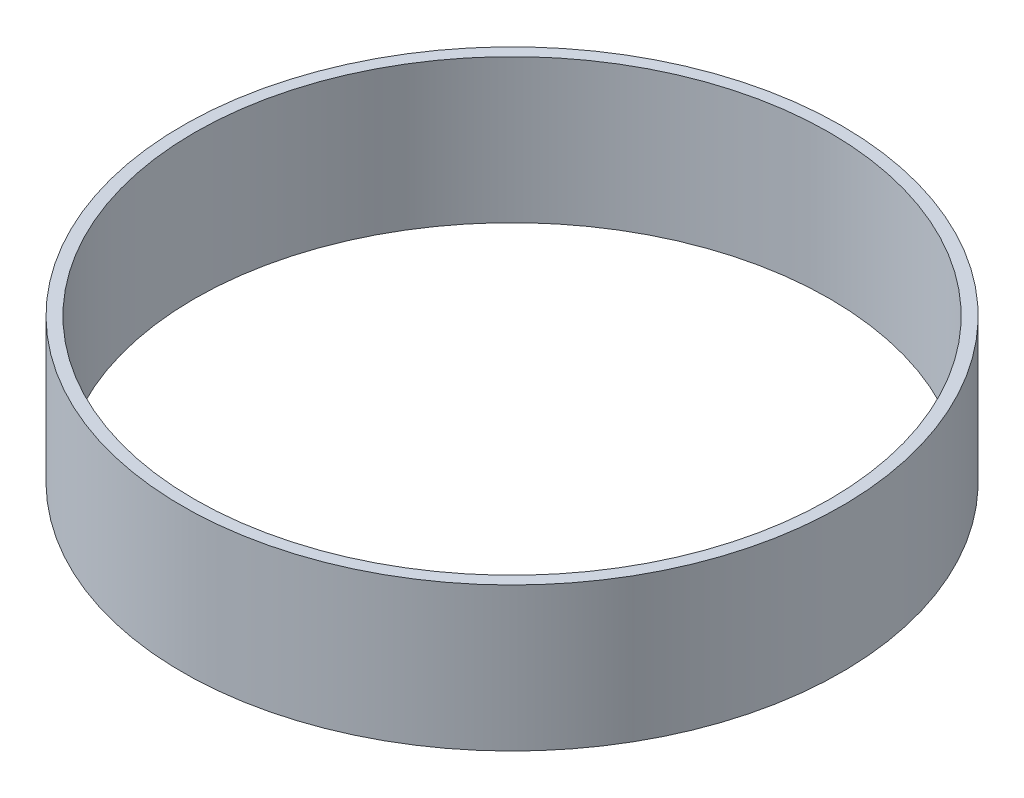
ISO-10303-21;
HEADER;
FILE_DESCRIPTION(('STEP AP214'),'2;1');
FILE_NAME('part.step','',(''),(''),'','','');
FILE_SCHEMA(('AUTOMOTIVE_DESIGN { 1 0 10303 214 1 1 1 1 }'));
ENDSEC;
DATA;
#1=APPLICATION_CONTEXT('core data for automotive mechanical design processes');
#2=APPLICATION_PROTOCOL_DEFINITION('international standard','automotive_design',2000,#1);
#3=PRODUCT_CONTEXT('',#1,'mechanical');
#4=PRODUCT('Part','Part','',(#3));
#5=PRODUCT_RELATED_PRODUCT_CATEGORY('part','',(#4));
#6=PRODUCT_DEFINITION_FORMATION('','',#4);
#7=PRODUCT_DEFINITION_CONTEXT('part definition',#1,'design');
#8=PRODUCT_DEFINITION('design','',#6,#7);
#9=PRODUCT_DEFINITION_SHAPE('','',#8);
#10=(LENGTH_UNIT() NAMED_UNIT(*) SI_UNIT(.MILLI.,.METRE.));
#11=(NAMED_UNIT(*) PLANE_ANGLE_UNIT() SI_UNIT($,.RADIAN.));
#12=(NAMED_UNIT(*) SI_UNIT($,.STERADIAN.) SOLID_ANGLE_UNIT());
#13=UNCERTAINTY_MEASURE_WITH_UNIT(LENGTH_MEASURE(1.E-05),#10,'distance_accuracy_value','');
#14=(GEOMETRIC_REPRESENTATION_CONTEXT(3) GLOBAL_UNCERTAINTY_ASSIGNED_CONTEXT((#13)) GLOBAL_UNIT_ASSIGNED_CONTEXT((#10,
#11,#12)) REPRESENTATION_CONTEXT('',''));
#15=CARTESIAN_POINT('',(0.,0.,0.));
#16=DIRECTION('',(0.,0.,1.));
#17=DIRECTION('',(1.,0.,0.));
#18=AXIS2_PLACEMENT_3D('',#15,#16,#17);
#19=CARTESIAN_POINT('',(0.,38.1,0.));
#20=DIRECTION('',(0.,1.,0.));
#21=DIRECTION('',(0.,0.,1.));
#22=AXIS2_PLACEMENT_3D('',#19,#20,#21);
#23=PLANE('',#22);
#24=CARTESIAN_POINT('',(0.,38.1,0.));
#25=DIRECTION('',(0.,1.,0.));
#26=DIRECTION('',(0.,0.,1.));
#27=AXIS2_PLACEMENT_3D('',#24,#25,#26);
#28=CIRCLE('',#27,87.3125);
#29=CARTESIAN_POINT('',(0.,38.1,-87.3125));
#30=VERTEX_POINT('',#29);
#31=EDGE_CURVE('E10',#30,#30,#28,.T.);
#32=ORIENTED_EDGE('',*,*,#31,.T.);
#33=EDGE_LOOP('',(#32));
#34=FACE_BOUND('',#33,.T.);
#35=CARTESIAN_POINT('',(0.,38.1,0.));
#36=DIRECTION('',(0.,1.,0.));
#37=DIRECTION('',(0.,0.,1.));
#38=AXIS2_PLACEMENT_3D('',#35,#36,#37);
#39=CIRCLE('',#38,84.1375);
#40=CARTESIAN_POINT('',(0.,38.1,-84.1375));
#41=VERTEX_POINT('',#40);
#42=EDGE_CURVE('E41',#41,#41,#39,.T.);
#43=ORIENTED_EDGE('',*,*,#42,.F.);
#44=EDGE_LOOP('',(#43));
#45=FACE_BOUND('',#44,.T.);
#46=ADVANCED_FACE('F30',(#34,#45),#23,.T.);
#47=CARTESIAN_POINT('',(0.,0.,0.));
#48=DIRECTION('',(0.,1.,0.));
#49=DIRECTION('',(0.,0.,1.));
#50=AXIS2_PLACEMENT_3D('',#47,#48,#49);
#51=PLANE('',#50);
#52=CARTESIAN_POINT('',(0.,0.,0.));
#53=DIRECTION('',(0.,1.,0.));
#54=DIRECTION('',(0.,0.,1.));
#55=AXIS2_PLACEMENT_3D('',#52,#53,#54);
#56=CIRCLE('',#55,87.3125);
#57=CARTESIAN_POINT('',(0.,0.,-87.3125));
#58=VERTEX_POINT('',#57);
#59=EDGE_CURVE('E34',#58,#58,#56,.T.);
#60=ORIENTED_EDGE('',*,*,#59,.F.);
#61=EDGE_LOOP('',(#60));
#62=FACE_BOUND('',#61,.T.);
#63=CARTESIAN_POINT('',(0.,0.,0.));
#64=DIRECTION('',(0.,1.,0.));
#65=DIRECTION('',(0.,0.,1.));
#66=AXIS2_PLACEMENT_3D('',#63,#64,#65);
#67=CIRCLE('',#66,84.1375);
#68=CARTESIAN_POINT('',(0.,0.,-84.1375));
#69=VERTEX_POINT('',#68);
#70=EDGE_CURVE('E43',#69,#69,#67,.T.);
#71=ORIENTED_EDGE('',*,*,#70,.T.);
#72=EDGE_LOOP('',(#71));
#73=FACE_BOUND('',#72,.T.);
#74=ADVANCED_FACE('F53',(#62,#73),#51,.F.);
#75=CARTESIAN_POINT('',(0.,38.1,0.));
#76=DIRECTION('',(0.,-1.,0.));
#77=DIRECTION('',(0.,0.,-1.));
#78=AXIS2_PLACEMENT_3D('',#75,#76,#77);
#79=CYLINDRICAL_SURFACE('',#78,87.3125);
#80=CARTESIAN_POINT('',(0.,38.1,-87.3125));
#81=CARTESIAN_POINT('',(0.,37.703125,-87.3125));
#82=CARTESIAN_POINT('',(0.,37.30625,-87.3125));
#83=CARTESIAN_POINT('',(0.,36.5125,-87.3125));
#84=CARTESIAN_POINT('',(0.,36.115625,-87.3125));
#85=CARTESIAN_POINT('',(0.,35.321875,-87.3125));
#86=CARTESIAN_POINT('',(0.,34.925,-87.3125));
#87=CARTESIAN_POINT('',(0.,34.13125,-87.3125));
#88=CARTESIAN_POINT('',(0.,33.734375,-87.3125));
#89=CARTESIAN_POINT('',(0.,32.940625,-87.3125));
#90=CARTESIAN_POINT('',(0.,32.54375,-87.3125));
#91=CARTESIAN_POINT('',(0.,31.75,-87.3125));
#92=CARTESIAN_POINT('',(0.,31.353125,-87.3125));
#93=CARTESIAN_POINT('',(0.,30.559375,-87.3125));
#94=CARTESIAN_POINT('',(0.,30.1625,-87.3125));
#95=CARTESIAN_POINT('',(0.,29.36875,-87.3125));
#96=CARTESIAN_POINT('',(0.,28.971875,-87.3125));
#97=CARTESIAN_POINT('',(0.,28.178125,-87.3125));
#98=CARTESIAN_POINT('',(0.,27.78125,-87.3125));
#99=CARTESIAN_POINT('',(0.,26.9875,-87.3125));
#100=CARTESIAN_POINT('',(0.,26.590625,-87.3125));
#101=CARTESIAN_POINT('',(0.,25.796875,-87.3125));
#102=CARTESIAN_POINT('',(0.,25.4,-87.3125));
#103=CARTESIAN_POINT('',(0.,24.60625,-87.3125));
#104=CARTESIAN_POINT('',(0.,24.209375,-87.3125));
#105=CARTESIAN_POINT('',(0.,23.415625,-87.3125));
#106=CARTESIAN_POINT('',(0.,23.01875,-87.3125));
#107=CARTESIAN_POINT('',(0.,22.225,-87.3125));
#108=CARTESIAN_POINT('',(0.,21.828125,-87.3125));
#109=CARTESIAN_POINT('',(0.,21.034375,-87.3125));
#110=CARTESIAN_POINT('',(0.,20.6375,-87.3125));
#111=CARTESIAN_POINT('',(0.,19.84375,-87.3125));
#112=CARTESIAN_POINT('',(0.,19.446875,-87.3125));
#113=CARTESIAN_POINT('',(0.,18.653125,-87.3125));
#114=CARTESIAN_POINT('',(0.,18.25625,-87.3125));
#115=CARTESIAN_POINT('',(0.,17.4625,-87.3125));
#116=CARTESIAN_POINT('',(0.,17.065625,-87.3125));
#117=CARTESIAN_POINT('',(0.,16.271875,-87.3125));
#118=CARTESIAN_POINT('',(0.,15.875,-87.3125));
#119=CARTESIAN_POINT('',(0.,15.08125,-87.3125));
#120=CARTESIAN_POINT('',(0.,14.684375,-87.3125));
#121=CARTESIAN_POINT('',(0.,13.890625,-87.3125));
#122=CARTESIAN_POINT('',(0.,13.49375,-87.3125));
#123=CARTESIAN_POINT('',(0.,12.7,-87.3125));
#124=CARTESIAN_POINT('',(0.,12.303125,-87.3125));
#125=CARTESIAN_POINT('',(0.,11.509375,-87.3125));
#126=CARTESIAN_POINT('',(0.,11.1125,-87.3125));
#127=CARTESIAN_POINT('',(0.,10.31875,-87.3125));
#128=CARTESIAN_POINT('',(0.,9.921875,-87.3125));
#129=CARTESIAN_POINT('',(0.,9.128125,-87.3125));
#130=CARTESIAN_POINT('',(0.,8.73125,-87.3125));
#131=CARTESIAN_POINT('',(0.,7.9375,-87.3125));
#132=CARTESIAN_POINT('',(0.,7.540625,-87.3125));
#133=CARTESIAN_POINT('',(0.,6.746875,-87.3125));
#134=CARTESIAN_POINT('',(0.,6.35,-87.3125));
#135=CARTESIAN_POINT('',(0.,5.55625,-87.3125));
#136=CARTESIAN_POINT('',(0.,5.159375,-87.3125));
#137=CARTESIAN_POINT('',(0.,4.365625,-87.3125));
#138=CARTESIAN_POINT('',(0.,3.96875,-87.3125));
#139=CARTESIAN_POINT('',(0.,3.175,-87.3125));
#140=CARTESIAN_POINT('',(0.,2.778125,-87.3125));
#141=CARTESIAN_POINT('',(0.,1.984375,-87.3125));
#142=CARTESIAN_POINT('',(0.,1.5875,-87.3125));
#143=CARTESIAN_POINT('',(0.,0.79375,-87.3125));
#144=CARTESIAN_POINT('',(0.,0.396875,-87.3125));
#145=CARTESIAN_POINT('',(0.,0.,-87.3125));
#146=B_SPLINE_CURVE_WITH_KNOTS('',3,(#80,#81,#82,#83,#84,#85,#86,#87,#88,#89,#90,#91,#92,#93,
#94,#95,#96,#97,#98,#99,#100,#101,#102,#103,#104,#105,#106,#107,#108,#109,#110,#111,#112,#113,
#114,#115,#116,#117,#118,#119,#120,#121,#122,#123,#124,#125,#126,#127,#128,#129,#130,#131,#132,
#133,#134,#135,#136,#137,#138,#139,#140,#141,#142,#143,#144,#145),.UNSPECIFIED.,.F.,.F.,(4,2,2,
2,2,2,2,2,2,2,2,2,2,2,2,2,2,2,2,2,2,2,2,2,2,2,2,2,2,2,2,2,4),(0.,1.19062499999999,
2.38124999999999,3.571875,4.7625,5.953125,7.14375,8.33437499999999,9.525,10.715625,11.90625,
13.096875,14.2875,15.478125,16.66875,17.859375,19.05,20.240625,21.43125,22.621875,23.8125,
25.003125,26.19375,27.384375,28.575,29.765625,30.95625,32.146875,33.3375,34.528125,35.71875,
36.909375,38.1),.UNSPECIFIED.);
#147=EDGE_CURVE('BSEAM32',#30,#58,#146,.T.);
#148=ORIENTED_EDGE('',*,*,#31,.F.);
#149=ORIENTED_EDGE('',*,*,#59,.T.);
#150=ORIENTED_EDGE('',*,*,#147,.T.);
#151=ORIENTED_EDGE('',*,*,#147,.F.);
#152=EDGE_LOOP('',(#148,#150,#149,#151));
#153=FACE_BOUND('',#152,.T.);
#154=ADVANCED_FACE('F32',(#153),#79,.T.);
#155=CARTESIAN_POINT('',(0.,38.1,0.));
#156=DIRECTION('',(0.,-1.,0.));
#157=DIRECTION('',(0.,0.,-1.));
#158=AXIS2_PLACEMENT_3D('',#155,#156,#157);
#159=CYLINDRICAL_SURFACE('',#158,84.1375);
#160=CARTESIAN_POINT('',(0.,38.1,-84.1375));
#161=CARTESIAN_POINT('',(0.,37.703125,-84.1375));
#162=CARTESIAN_POINT('',(0.,37.30625,-84.1375));
#163=CARTESIAN_POINT('',(0.,36.5125,-84.1375));
#164=CARTESIAN_POINT('',(0.,36.115625,-84.1375));
#165=CARTESIAN_POINT('',(0.,35.321875,-84.1375));
#166=CARTESIAN_POINT('',(0.,34.925,-84.1375));
#167=CARTESIAN_POINT('',(0.,34.13125,-84.1375));
#168=CARTESIAN_POINT('',(0.,33.734375,-84.1375));
#169=CARTESIAN_POINT('',(0.,32.940625,-84.1375));
#170=CARTESIAN_POINT('',(0.,32.54375,-84.1375));
#171=CARTESIAN_POINT('',(0.,31.75,-84.1375));
#172=CARTESIAN_POINT('',(0.,31.353125,-84.1375));
#173=CARTESIAN_POINT('',(0.,30.559375,-84.1375));
#174=CARTESIAN_POINT('',(0.,30.1625,-84.1375));
#175=CARTESIAN_POINT('',(0.,29.36875,-84.1375));
#176=CARTESIAN_POINT('',(0.,28.971875,-84.1375));
#177=CARTESIAN_POINT('',(0.,28.178125,-84.1375));
#178=CARTESIAN_POINT('',(0.,27.78125,-84.1375));
#179=CARTESIAN_POINT('',(0.,26.9875,-84.1375));
#180=CARTESIAN_POINT('',(0.,26.590625,-84.1375));
#181=CARTESIAN_POINT('',(0.,25.796875,-84.1375));
#182=CARTESIAN_POINT('',(0.,25.4,-84.1375));
#183=CARTESIAN_POINT('',(0.,24.60625,-84.1375));
#184=CARTESIAN_POINT('',(0.,24.209375,-84.1375));
#185=CARTESIAN_POINT('',(0.,23.415625,-84.1375));
#186=CARTESIAN_POINT('',(0.,23.01875,-84.1375));
#187=CARTESIAN_POINT('',(0.,22.225,-84.1375));
#188=CARTESIAN_POINT('',(0.,21.828125,-84.1375));
#189=CARTESIAN_POINT('',(0.,21.034375,-84.1375));
#190=CARTESIAN_POINT('',(0.,20.6375,-84.1375));
#191=CARTESIAN_POINT('',(0.,19.84375,-84.1375));
#192=CARTESIAN_POINT('',(0.,19.446875,-84.1375));
#193=CARTESIAN_POINT('',(0.,18.653125,-84.1375));
#194=CARTESIAN_POINT('',(0.,18.25625,-84.1375));
#195=CARTESIAN_POINT('',(0.,17.4625,-84.1375));
#196=CARTESIAN_POINT('',(0.,17.065625,-84.1375));
#197=CARTESIAN_POINT('',(0.,16.271875,-84.1375));
#198=CARTESIAN_POINT('',(0.,15.875,-84.1375));
#199=CARTESIAN_POINT('',(0.,15.08125,-84.1375));
#200=CARTESIAN_POINT('',(0.,14.684375,-84.1375));
#201=CARTESIAN_POINT('',(0.,13.890625,-84.1375));
#202=CARTESIAN_POINT('',(0.,13.49375,-84.1375));
#203=CARTESIAN_POINT('',(0.,12.7,-84.1375));
#204=CARTESIAN_POINT('',(0.,12.303125,-84.1375));
#205=CARTESIAN_POINT('',(0.,11.509375,-84.1375));
#206=CARTESIAN_POINT('',(0.,11.1125,-84.1375));
#207=CARTESIAN_POINT('',(0.,10.31875,-84.1375));
#208=CARTESIAN_POINT('',(0.,9.92187499999999,-84.1375));
#209=CARTESIAN_POINT('',(0.,9.128125,-84.1375));
#210=CARTESIAN_POINT('',(0.,8.73124999999999,-84.1375));
#211=CARTESIAN_POINT('',(0.,7.93749999999999,-84.1375));
#212=CARTESIAN_POINT('',(0.,7.54062499999999,-84.1375));
#213=CARTESIAN_POINT('',(0.,6.746875,-84.1375));
#214=CARTESIAN_POINT('',(0.,6.35,-84.1375));
#215=CARTESIAN_POINT('',(0.,5.55625,-84.1375));
#216=CARTESIAN_POINT('',(0.,5.159375,-84.1375));
#217=CARTESIAN_POINT('',(0.,4.365625,-84.1375));
#218=CARTESIAN_POINT('',(0.,3.96875,-84.1375));
#219=CARTESIAN_POINT('',(0.,3.175,-84.1375));
#220=CARTESIAN_POINT('',(0.,2.778125,-84.1375));
#221=CARTESIAN_POINT('',(0.,1.984375,-84.1375));
#222=CARTESIAN_POINT('',(0.,1.5875,-84.1375));
#223=CARTESIAN_POINT('',(0.,0.79375,-84.1375));
#224=CARTESIAN_POINT('',(0.,0.396875,-84.1375));
#225=CARTESIAN_POINT('',(0.,0.,-84.1375));
#226=B_SPLINE_CURVE_WITH_KNOTS('',3,(#160,#161,#162,#163,#164,#165,#166,#167,#168,#169,#170,
#171,#172,#173,#174,#175,#176,#177,#178,#179,#180,#181,#182,#183,#184,#185,#186,#187,#188,#189,
#190,#191,#192,#193,#194,#195,#196,#197,#198,#199,#200,#201,#202,#203,#204,#205,#206,#207,#208,
#209,#210,#211,#212,#213,#214,#215,#216,#217,#218,#219,#220,#221,#222,#223,#224,#225),
.UNSPECIFIED.,.F.,.F.,(4,2,2,2,2,2,2,2,2,2,2,2,2,2,2,2,2,2,2,2,2,2,2,2,2,2,2,2,2,2,2,2,4),(0.,
1.190625,2.38125,3.571875,4.7625,5.953125,7.14375,8.334375,9.52500000000001,10.715625,11.90625,
13.096875,14.2875,15.478125,16.66875,17.859375,19.05,20.240625,21.43125,22.621875,23.8125,
25.003125,26.19375,27.384375,28.575,29.765625,30.95625,32.146875,33.3375,34.528125,35.71875,
36.909375,38.1),.UNSPECIFIED.);
#227=EDGE_CURVE('BSEAM49',#41,#69,#226,.T.);
#228=ORIENTED_EDGE('',*,*,#42,.T.);
#229=ORIENTED_EDGE('',*,*,#70,.F.);
#230=ORIENTED_EDGE('',*,*,#227,.T.);
#231=ORIENTED_EDGE('',*,*,#227,.F.);
#232=EDGE_LOOP('',(#228,#230,#229,#231));
#233=FACE_BOUND('',#232,.T.);
#234=ADVANCED_FACE('F49',(#233),#159,.F.);
#235=CLOSED_SHELL('',(#46,#74,#154,#234));
#236=MANIFOLD_SOLID_BREP('B2',#235);
#237=ADVANCED_BREP_SHAPE_REPRESENTATION('',(#18,#236),#14);
#238=SHAPE_DEFINITION_REPRESENTATION(#9,#237);
ENDSEC;
END-ISO-10303-21;
